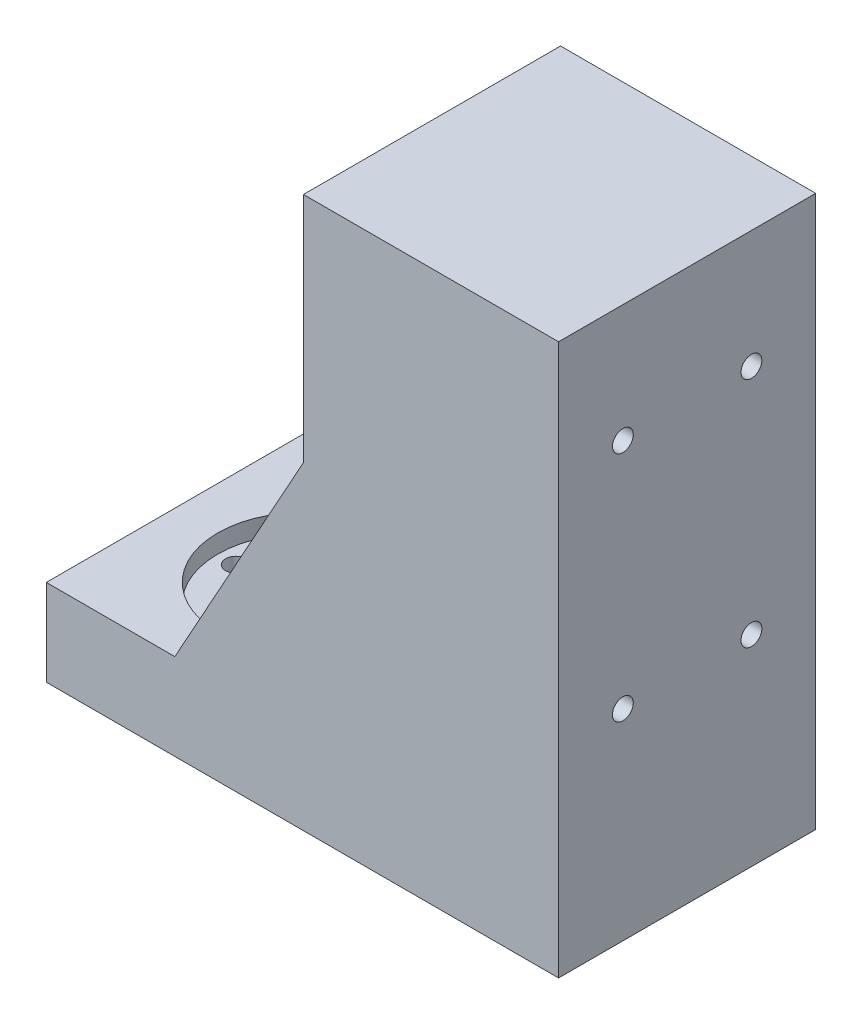
ISO-10303-21;
HEADER;
FILE_DESCRIPTION(('STEP AP214'),'2;1');
FILE_NAME('part.step','',(''),(''),'','','');
FILE_SCHEMA(('AUTOMOTIVE_DESIGN { 1 0 10303 214 1 1 1 1 }'));
ENDSEC;
DATA;
#1=APPLICATION_CONTEXT('core data for automotive mechanical design processes');
#2=APPLICATION_PROTOCOL_DEFINITION('international standard','automotive_design',2000,#1);
#3=PRODUCT_CONTEXT('',#1,'mechanical');
#4=PRODUCT('Part','Part','',(#3));
#5=PRODUCT_RELATED_PRODUCT_CATEGORY('part','',(#4));
#6=PRODUCT_DEFINITION_FORMATION('','',#4);
#7=PRODUCT_DEFINITION_CONTEXT('part definition',#1,'design');
#8=PRODUCT_DEFINITION('design','',#6,#7);
#9=PRODUCT_DEFINITION_SHAPE('','',#8);
#10=(LENGTH_UNIT() NAMED_UNIT(*) SI_UNIT(.MILLI.,.METRE.));
#11=(NAMED_UNIT(*) PLANE_ANGLE_UNIT() SI_UNIT($,.RADIAN.));
#12=(NAMED_UNIT(*) SI_UNIT($,.STERADIAN.) SOLID_ANGLE_UNIT());
#13=UNCERTAINTY_MEASURE_WITH_UNIT(LENGTH_MEASURE(1.E-05),#10,'distance_accuracy_value','');
#14=(GEOMETRIC_REPRESENTATION_CONTEXT(3) GLOBAL_UNCERTAINTY_ASSIGNED_CONTEXT((#13)) GLOBAL_UNIT_ASSIGNED_CONTEXT((#10,
#11,#12)) REPRESENTATION_CONTEXT('',''));
#15=CARTESIAN_POINT('',(0.,0.,0.));
#16=DIRECTION('',(0.,0.,1.));
#17=DIRECTION('',(1.,0.,0.));
#18=AXIS2_PLACEMENT_3D('',#15,#16,#17);
#19=CARTESIAN_POINT('',(21.,-14.1207956609657,21.));
#20=DIRECTION('',(0.,1.,0.));
#21=DIRECTION('',(0.,0.,1.));
#22=AXIS2_PLACEMENT_3D('',#19,#20,#21);
#23=CYLINDRICAL_SURFACE('',#22,2.99999999999999);
#24=CARTESIAN_POINT('',(21.,-14.1207956609657,21.));
#25=DIRECTION('',(0.,1.,0.));
#26=DIRECTION('',(0.,0.,1.));
#27=AXIS2_PLACEMENT_3D('',#24,#25,#26);
#28=CIRCLE('',#27,2.99999999999999);
#29=CARTESIAN_POINT('',(21.,-14.1207956609657,24.));
#30=VERTEX_POINT('',#29);
#31=EDGE_CURVE('E221',#30,#30,#28,.T.);
#32=CARTESIAN_POINT('',(21.,-5.,21.));
#33=DIRECTION('',(0.,1.,0.));
#34=DIRECTION('',(0.,0.,1.));
#35=AXIS2_PLACEMENT_3D('',#32,#33,#34);
#36=CIRCLE('',#35,2.99999999999999);
#37=CARTESIAN_POINT('',(21.,-5.,24.));
#38=VERTEX_POINT('',#37);
#39=EDGE_CURVE('E47',#38,#38,#36,.F.);
#40=CARTESIAN_POINT('',(21.,-14.1207956609657,24.));
#41=CARTESIAN_POINT('',(21.,-14.0257873728307,24.));
#42=CARTESIAN_POINT('',(21.,-13.9307790846956,24.));
#43=CARTESIAN_POINT('',(21.,-13.7407625084255,24.));
#44=CARTESIAN_POINT('',(21.,-13.6457542202904,24.));
#45=CARTESIAN_POINT('',(21.,-13.4557376440203,24.));
#46=CARTESIAN_POINT('',(21.,-13.3607293558853,24.));
#47=CARTESIAN_POINT('',(21.,-13.1707127796151,24.));
#48=CARTESIAN_POINT('',(21.,-13.0757044914801,24.));
#49=CARTESIAN_POINT('',(21.,-12.88568791521,24.));
#50=CARTESIAN_POINT('',(21.,-12.7906796270749,24.));
#51=CARTESIAN_POINT('',(21.,-12.6006630508048,24.));
#52=CARTESIAN_POINT('',(21.,-12.5056547626697,24.));
#53=CARTESIAN_POINT('',(21.,-12.3156381863996,24.));
#54=CARTESIAN_POINT('',(21.,-12.2206298982645,24.));
#55=CARTESIAN_POINT('',(21.,-12.0306133219944,24.));
#56=CARTESIAN_POINT('',(21.,-11.9356050338594,24.));
#57=CARTESIAN_POINT('',(21.,-11.7455884575892,24.));
#58=CARTESIAN_POINT('',(21.,-11.6505801694542,24.));
#59=CARTESIAN_POINT('',(21.,-11.4605635931841,24.));
#60=CARTESIAN_POINT('',(21.,-11.365555305049,24.));
#61=CARTESIAN_POINT('',(21.,-11.1755387287789,24.));
#62=CARTESIAN_POINT('',(21.,-11.0805304406438,24.));
#63=CARTESIAN_POINT('',(21.,-10.8905138643737,24.));
#64=CARTESIAN_POINT('',(21.,-10.7955055762386,24.));
#65=CARTESIAN_POINT('',(21.,-10.6054889999685,24.));
#66=CARTESIAN_POINT('',(21.,-10.5104807118335,24.));
#67=CARTESIAN_POINT('',(21.,-10.3204641355633,24.));
#68=CARTESIAN_POINT('',(21.,-10.2254558474283,24.));
#69=CARTESIAN_POINT('',(21.,-10.0354392711582,24.));
#70=CARTESIAN_POINT('',(21.,-9.94043098302311,24.));
#71=CARTESIAN_POINT('',(21.,-9.75041440675299,24.));
#72=CARTESIAN_POINT('',(21.,-9.65540611861793,24.));
#73=CARTESIAN_POINT('',(21.,-9.46538954234781,24.));
#74=CARTESIAN_POINT('',(21.,-9.37038125421275,24.));
#75=CARTESIAN_POINT('',(21.,-9.18036467794263,24.));
#76=CARTESIAN_POINT('',(21.,-9.08535638980757,24.));
#77=CARTESIAN_POINT('',(21.,-8.89533981353745,24.));
#78=CARTESIAN_POINT('',(21.,-8.80033152540239,24.));
#79=CARTESIAN_POINT('',(21.,-8.61031494913227,24.));
#80=CARTESIAN_POINT('',(21.,-8.51530666099721,24.));
#81=CARTESIAN_POINT('',(21.,-8.32529008472709,24.));
#82=CARTESIAN_POINT('',(21.,-8.23028179659203,24.));
#83=CARTESIAN_POINT('',(21.,-8.04026522032191,24.));
#84=CARTESIAN_POINT('',(21.,-7.94525693218685,24.));
#85=CARTESIAN_POINT('',(21.,-7.75524035591673,24.));
#86=CARTESIAN_POINT('',(21.,-7.66023206778167,24.));
#87=CARTESIAN_POINT('',(21.,-7.47021549151155,24.));
#88=CARTESIAN_POINT('',(21.,-7.37520720337649,24.));
#89=CARTESIAN_POINT('',(21.,-7.18519062710637,24.));
#90=CARTESIAN_POINT('',(21.,-7.09018233897131,24.));
#91=CARTESIAN_POINT('',(21.,-6.90016576270119,24.));
#92=CARTESIAN_POINT('',(21.,-6.80515747456614,24.));
#93=CARTESIAN_POINT('',(21.,-6.61514089829602,24.));
#94=CARTESIAN_POINT('',(21.,-6.52013261016096,24.));
#95=CARTESIAN_POINT('',(21.,-6.33011603389084,24.));
#96=CARTESIAN_POINT('',(21.,-6.23510774575578,24.));
#97=CARTESIAN_POINT('',(21.,-6.04509116948566,24.));
#98=CARTESIAN_POINT('',(21.,-5.9500828813506,24.));
#99=CARTESIAN_POINT('',(21.,-5.76006630508048,24.));
#100=CARTESIAN_POINT('',(21.,-5.66505801694542,24.));
#101=CARTESIAN_POINT('',(21.,-5.4750414406753,24.));
#102=CARTESIAN_POINT('',(21.,-5.38003315254024,24.));
#103=CARTESIAN_POINT('',(21.,-5.19001657627012,24.));
#104=CARTESIAN_POINT('',(21.,-5.09500828813506,24.));
#105=CARTESIAN_POINT('',(21.,-5.,24.));
#106=B_SPLINE_CURVE_WITH_KNOTS('',3,(#40,#41,#42,#43,#44,#45,#46,#47,#48,#49,#50,#51,#52,#53,
#54,#55,#56,#57,#58,#59,#60,#61,#62,#63,#64,#65,#66,#67,#68,#69,#70,#71,#72,#73,#74,#75,#76,#77,
#78,#79,#80,#81,#82,#83,#84,#85,#86,#87,#88,#89,#90,#91,#92,#93,#94,#95,#96,#97,#98,#99,#100,
#101,#102,#103,#104,#105),.UNSPECIFIED.,.F.,.F.,(4,2,2,2,2,2,2,2,2,2,2,2,2,2,2,2,2,2,2,2,2,2,2,
2,2,2,2,2,2,2,2,2,4),(0.,0.285024864405179,0.570049728810359,0.855074593215538,1.14009945762072,
1.4251243220259,1.71014918643107,1.99517405083625,2.28019891524143,2.56522377964661,
2.85024864405179,3.13527350845697,3.42029837286215,3.70532323726733,3.99034810167251,
4.27537296607769,4.56039783048287,4.84542269488805,5.13044755929322,5.4154724236984,
5.70049728810358,5.98552215250876,6.27054701691394,6.55557188131912,6.8405967457243,
7.12562161012948,7.41064647453466,7.69567133893984,7.98069620334502,8.26572106775019,
8.55074593215537,8.83577079656055,9.12079566096573),.UNSPECIFIED.);
#107=EDGE_CURVE('BSEAM44',#30,#38,#106,.T.);
#108=ORIENTED_EDGE('',*,*,#31,.F.);
#109=ORIENTED_EDGE('',*,*,#39,.F.);
#110=ORIENTED_EDGE('',*,*,#107,.T.);
#111=ORIENTED_EDGE('',*,*,#107,.F.);
#112=EDGE_LOOP('',(#108,#110,#109,#111));
#113=FACE_BOUND('',#112,.T.);
#114=ADVANCED_FACE('F44',(#113),#23,.F.);
#115=CARTESIAN_POINT('',(0.,0.,42.));
#116=DIRECTION('',(1.,0.,0.));
#117=DIRECTION('',(0.,1.,0.));
#118=AXIS2_PLACEMENT_3D('',#115,#116,#117);
#119=PLANE('',#118);
#120=DIRECTION('',(0.,-1.,0.));
#121=VECTOR('',#120,1.);
#122=CARTESIAN_POINT('',(0.,0.,0.));
#123=LINE('',#122,#121);
#124=CARTESIAN_POINT('',(0.,0.,0.));
#125=VERTEX_POINT('',#124);
#126=CARTESIAN_POINT('',(0.,-14.1207956609657,0.));
#127=VERTEX_POINT('',#126);
#128=EDGE_CURVE('E135',#125,#127,#123,.T.);
#129=ORIENTED_EDGE('',*,*,#128,.T.);
#130=DIRECTION('',(0.,0.,-1.));
#131=VECTOR('',#130,1.);
#132=CARTESIAN_POINT('',(0.,-14.1207956609657,42.));
#133=LINE('',#132,#131);
#134=CARTESIAN_POINT('',(0.,-14.1207956609657,42.));
#135=VERTEX_POINT('',#134);
#136=EDGE_CURVE('E11',#135,#127,#133,.T.);
#137=ORIENTED_EDGE('',*,*,#136,.F.);
#138=DIRECTION('',(0.,-1.,0.));
#139=VECTOR('',#138,1.);
#140=CARTESIAN_POINT('',(0.,0.,42.));
#141=LINE('',#140,#139);
#142=CARTESIAN_POINT('',(0.,0.,42.));
#143=VERTEX_POINT('',#142);
#144=EDGE_CURVE('E134',#143,#135,#141,.T.);
#145=ORIENTED_EDGE('',*,*,#144,.F.);
#146=DIRECTION('',(0.,0.,-1.));
#147=VECTOR('',#146,1.);
#148=CARTESIAN_POINT('',(0.,0.,42.));
#149=LINE('',#148,#147);
#150=EDGE_CURVE('E241',#143,#125,#149,.T.);
#151=ORIENTED_EDGE('',*,*,#150,.T.);
#152=EDGE_LOOP('',(#129,#137,#145,#151));
#153=FACE_BOUND('',#152,.T.);
#154=ADVANCED_FACE('F50',(#153),#119,.F.);
#155=CARTESIAN_POINT('',(42.,-14.1207956609657,42.));
#156=DIRECTION('',(0.,1.,0.));
#157=DIRECTION('',(0.,0.,1.));
#158=AXIS2_PLACEMENT_3D('',#155,#156,#157);
#159=PLANE('',#158);
#160=CARTESIAN_POINT('',(21.,-14.1207956609657,10.));
#161=DIRECTION('',(0.,1.,0.));
#162=DIRECTION('',(0.,0.,1.));
#163=AXIS2_PLACEMENT_3D('',#160,#161,#162);
#164=CIRCLE('',#163,1.7);
#165=CARTESIAN_POINT('',(21.,-14.1207956609657,11.7));
#166=VERTEX_POINT('',#165);
#167=EDGE_CURVE('E212',#166,#166,#164,.T.);
#168=ORIENTED_EDGE('',*,*,#167,.T.);
#169=EDGE_LOOP('',(#168));
#170=FACE_BOUND('',#169,.T.);
#171=CARTESIAN_POINT('',(32.,-14.1207956609657,21.));
#172=DIRECTION('',(0.,1.,0.));
#173=DIRECTION('',(0.,0.,1.));
#174=AXIS2_PLACEMENT_3D('',#171,#172,#173);
#175=CIRCLE('',#174,1.7);
#176=CARTESIAN_POINT('',(32.,-14.1207956609657,22.7));
#177=VERTEX_POINT('',#176);
#178=EDGE_CURVE('E211',#177,#177,#175,.T.);
#179=ORIENTED_EDGE('',*,*,#178,.T.);
#180=EDGE_LOOP('',(#179));
#181=FACE_BOUND('',#180,.T.);
#182=CARTESIAN_POINT('',(21.,-14.1207956609657,32.));
#183=DIRECTION('',(0.,1.,0.));
#184=DIRECTION('',(0.,0.,1.));
#185=AXIS2_PLACEMENT_3D('',#182,#183,#184);
#186=CIRCLE('',#185,1.7);
#187=CARTESIAN_POINT('',(21.,-14.1207956609657,33.7));
#188=VERTEX_POINT('',#187);
#189=EDGE_CURVE('E208',#188,#188,#186,.T.);
#190=ORIENTED_EDGE('',*,*,#189,.T.);
#191=EDGE_LOOP('',(#190));
#192=FACE_BOUND('',#191,.T.);
#193=CARTESIAN_POINT('',(10.,-14.1207956609657,21.));
#194=DIRECTION('',(0.,1.,0.));
#195=DIRECTION('',(0.,0.,1.));
#196=AXIS2_PLACEMENT_3D('',#193,#194,#195);
#197=CIRCLE('',#196,1.7);
#198=CARTESIAN_POINT('',(10.,-14.1207956609657,22.7));
#199=VERTEX_POINT('',#198);
#200=EDGE_CURVE('E197',#199,#199,#197,.T.);
#201=ORIENTED_EDGE('',*,*,#200,.T.);
#202=EDGE_LOOP('',(#201));
#203=FACE_BOUND('',#202,.T.);
#204=ORIENTED_EDGE('',*,*,#31,.T.);
#205=EDGE_LOOP('',(#204));
#206=FACE_BOUND('',#205,.T.);
#207=DIRECTION('',(1.,0.,0.));
#208=VECTOR('',#207,1.);
#209=CARTESIAN_POINT('',(42.,-14.1207956609657,0.));
#210=LINE('',#209,#208);
#211=CARTESIAN_POINT('',(83.67900317515,-14.1207956609657,0.));
#212=VERTEX_POINT('',#211);
#213=EDGE_CURVE('E244',#127,#212,#210,.T.);
#214=ORIENTED_EDGE('',*,*,#213,.T.);
#215=DIRECTION('',(0.,0.,-1.));
#216=VECTOR('',#215,1.);
#217=CARTESIAN_POINT('',(83.67900317515,-14.1207956609657,42.));
#218=LINE('',#217,#216);
#219=CARTESIAN_POINT('',(83.67900317515,-14.1207956609657,42.));
#220=VERTEX_POINT('',#219);
#221=EDGE_CURVE('E53',#220,#212,#218,.T.);
#222=ORIENTED_EDGE('',*,*,#221,.F.);
#223=DIRECTION('',(1.,0.,0.));
#224=VECTOR('',#223,1.);
#225=CARTESIAN_POINT('',(0.,-14.1207956609657,42.));
#226=LINE('',#225,#224);
#227=EDGE_CURVE('E235',#135,#220,#226,.T.);
#228=ORIENTED_EDGE('',*,*,#227,.F.);
#229=ORIENTED_EDGE('',*,*,#136,.T.);
#230=EDGE_LOOP('',(#214,#222,#228,#229));
#231=FACE_BOUND('',#230,.T.);
#232=ADVANCED_FACE('F279',(#170,#181,#192,#203,#206,#231),#159,.F.);
#233=CARTESIAN_POINT('',(83.67900317515,-14.1207956609657,42.));
#234=DIRECTION('',(-1.,0.,0.));
#235=DIRECTION('',(0.,0.,1.));
#236=AXIS2_PLACEMENT_3D('',#233,#234,#235);
#237=PLANE('',#236);
#238=CARTESIAN_POINT('',(83.67900317515,56.6542043390343,31.5));
#239=DIRECTION('',(-1.,0.,0.));
#240=DIRECTION('',(0.,0.,1.));
#241=AXIS2_PLACEMENT_3D('',#238,#239,#240);
#242=CIRCLE('',#241,1.7);
#243=CARTESIAN_POINT('',(83.67900317515,56.6542043390343,33.2));
#244=VERTEX_POINT('',#243);
#245=EDGE_CURVE('E177',#244,#244,#242,.T.);
#246=ORIENTED_EDGE('',*,*,#245,.T.);
#247=EDGE_LOOP('',(#246));
#248=FACE_BOUND('',#247,.T.);
#249=CARTESIAN_POINT('',(83.67900317515,18.7146021695171,10.5));
#250=DIRECTION('',(-1.,0.,0.));
#251=DIRECTION('',(0.,0.,1.));
#252=AXIS2_PLACEMENT_3D('',#249,#250,#251);
#253=CIRCLE('',#252,1.7);
#254=CARTESIAN_POINT('',(83.67900317515,18.7146021695171,12.2));
#255=VERTEX_POINT('',#254);
#256=EDGE_CURVE('E171',#255,#255,#253,.T.);
#257=ORIENTED_EDGE('',*,*,#256,.T.);
#258=EDGE_LOOP('',(#257));
#259=FACE_BOUND('',#258,.T.);
#260=CARTESIAN_POINT('',(83.67900317515,18.7146021695171,31.5));
#261=DIRECTION('',(-1.,0.,0.));
#262=DIRECTION('',(0.,0.,1.));
#263=AXIS2_PLACEMENT_3D('',#260,#261,#262);
#264=CIRCLE('',#263,1.7);
#265=CARTESIAN_POINT('',(83.67900317515,18.7146021695171,33.2));
#266=VERTEX_POINT('',#265);
#267=EDGE_CURVE('E170',#266,#266,#264,.T.);
#268=ORIENTED_EDGE('',*,*,#267,.T.);
#269=EDGE_LOOP('',(#268));
#270=FACE_BOUND('',#269,.T.);
#271=CARTESIAN_POINT('',(83.67900317515,56.6542043390343,10.5));
#272=DIRECTION('',(-1.,0.,0.));
#273=DIRECTION('',(0.,0.,1.));
#274=AXIS2_PLACEMENT_3D('',#271,#272,#273);
#275=CIRCLE('',#274,1.7);
#276=CARTESIAN_POINT('',(83.67900317515,56.6542043390343,12.2));
#277=VERTEX_POINT('',#276);
#278=EDGE_CURVE('E186',#277,#277,#275,.T.);
#279=ORIENTED_EDGE('',*,*,#278,.T.);
#280=EDGE_LOOP('',(#279));
#281=FACE_BOUND('',#280,.T.);
#282=DIRECTION('',(0.,1.,0.));
#283=VECTOR('',#282,1.);
#284=CARTESIAN_POINT('',(83.67900317515,-14.1207956609657,0.));
#285=LINE('',#284,#283);
#286=CARTESIAN_POINT('',(83.67900317515,75.8792043390343,0.));
#287=VERTEX_POINT('',#286);
#288=EDGE_CURVE('E250',#212,#287,#285,.T.);
#289=ORIENTED_EDGE('',*,*,#288,.T.);
#290=DIRECTION('',(0.,0.,-1.));
#291=VECTOR('',#290,1.);
#292=CARTESIAN_POINT('',(83.67900317515,75.8792043390343,42.));
#293=LINE('',#292,#291);
#294=CARTESIAN_POINT('',(83.67900317515,75.8792043390343,42.));
#295=VERTEX_POINT('',#294);
#296=EDGE_CURVE('E256',#295,#287,#293,.T.);
#297=ORIENTED_EDGE('',*,*,#296,.F.);
#298=DIRECTION('',(0.,1.,0.));
#299=VECTOR('',#298,1.);
#300=CARTESIAN_POINT('',(83.67900317515,-14.1207956609657,42.));
#301=LINE('',#300,#299);
#302=EDGE_CURVE('E234',#220,#295,#301,.T.);
#303=ORIENTED_EDGE('',*,*,#302,.F.);
#304=ORIENTED_EDGE('',*,*,#221,.T.);
#305=EDGE_LOOP('',(#289,#297,#303,#304));
#306=FACE_BOUND('',#305,.T.);
#307=ADVANCED_FACE('F305',(#248,#259,#270,#281,#306),#237,.F.);
#308=CARTESIAN_POINT('',(83.67900317515,75.8792043390343,42.));
#309=DIRECTION('',(0.,-1.,0.));
#310=DIRECTION('',(0.,0.,-1.));
#311=AXIS2_PLACEMENT_3D('',#308,#309,#310);
#312=PLANE('',#311);
#313=DIRECTION('',(-1.,0.,0.));
#314=VECTOR('',#313,1.);
#315=CARTESIAN_POINT('',(83.67900317515,75.8792043390343,0.));
#316=LINE('',#315,#314);
#317=CARTESIAN_POINT('',(42.,75.8792043390343,0.));
#318=VERTEX_POINT('',#317);
#319=EDGE_CURVE('E249',#287,#318,#316,.T.);
#320=ORIENTED_EDGE('',*,*,#319,.T.);
#321=DIRECTION('',(0.,0.,-1.));
#322=VECTOR('',#321,1.);
#323=CARTESIAN_POINT('',(42.,75.8792043390343,42.));
#324=LINE('',#323,#322);
#325=CARTESIAN_POINT('',(42.,75.8792043390343,42.));
#326=VERTEX_POINT('',#325);
#327=EDGE_CURVE('E254',#326,#318,#324,.T.);
#328=ORIENTED_EDGE('',*,*,#327,.F.);
#329=DIRECTION('',(-1.,0.,0.));
#330=VECTOR('',#329,1.);
#331=CARTESIAN_POINT('',(83.67900317515,75.8792043390343,42.));
#332=LINE('',#331,#330);
#333=EDGE_CURVE('E237',#295,#326,#332,.T.);
#334=ORIENTED_EDGE('',*,*,#333,.F.);
#335=ORIENTED_EDGE('',*,*,#296,.T.);
#336=EDGE_LOOP('',(#320,#328,#334,#335));
#337=FACE_BOUND('',#336,.T.);
#338=ADVANCED_FACE('F296',(#337),#312,.F.);
#339=CARTESIAN_POINT('',(42.,75.8792043390343,42.));
#340=DIRECTION('',(1.,0.,0.));
#341=DIRECTION('',(0.,1.,0.));
#342=AXIS2_PLACEMENT_3D('',#339,#340,#341);
#343=PLANE('',#342);
#344=CARTESIAN_POINT('',(42.,56.6542043390343,31.5));
#345=DIRECTION('',(-1.,0.,0.));
#346=DIRECTION('',(0.,0.,1.));
#347=AXIS2_PLACEMENT_3D('',#344,#345,#346);
#348=CIRCLE('',#347,1.7);
#349=CARTESIAN_POINT('',(42.,56.6542043390343,33.2));
#350=VERTEX_POINT('',#349);
#351=EDGE_CURVE('E178',#350,#350,#348,.T.);
#352=ORIENTED_EDGE('',*,*,#351,.F.);
#353=EDGE_LOOP('',(#352));
#354=FACE_BOUND('',#353,.T.);
#355=CARTESIAN_POINT('',(42.,18.7146021695171,10.5));
#356=DIRECTION('',(-1.,0.,0.));
#357=DIRECTION('',(0.,0.,1.));
#358=AXIS2_PLACEMENT_3D('',#355,#356,#357);
#359=CIRCLE('',#358,1.7);
#360=CARTESIAN_POINT('',(42.,18.7146021695171,12.2));
#361=VERTEX_POINT('',#360);
#362=EDGE_CURVE('E181',#361,#361,#359,.T.);
#363=ORIENTED_EDGE('',*,*,#362,.F.);
#364=EDGE_LOOP('',(#363));
#365=FACE_BOUND('',#364,.T.);
#366=CARTESIAN_POINT('',(42.,18.7146021695171,31.5));
#367=DIRECTION('',(-1.,0.,0.));
#368=DIRECTION('',(0.,0.,1.));
#369=AXIS2_PLACEMENT_3D('',#366,#367,#368);
#370=CIRCLE('',#369,1.7);
#371=CARTESIAN_POINT('',(42.,18.7146021695171,33.2));
#372=VERTEX_POINT('',#371);
#373=EDGE_CURVE('E168',#372,#372,#370,.T.);
#374=ORIENTED_EDGE('',*,*,#373,.F.);
#375=EDGE_LOOP('',(#374));
#376=FACE_BOUND('',#375,.T.);
#377=CARTESIAN_POINT('',(42.,56.6542043390343,10.5));
#378=DIRECTION('',(-1.,0.,0.));
#379=DIRECTION('',(0.,0.,1.));
#380=AXIS2_PLACEMENT_3D('',#377,#378,#379);
#381=CIRCLE('',#380,1.7);
#382=CARTESIAN_POINT('',(42.,56.6542043390343,12.2));
#383=VERTEX_POINT('',#382);
#384=EDGE_CURVE('E179',#383,#383,#381,.T.);
#385=ORIENTED_EDGE('',*,*,#384,.F.);
#386=EDGE_LOOP('',(#385));
#387=FACE_BOUND('',#386,.T.);
#388=DIRECTION('',(0.,-1.,0.));
#389=VECTOR('',#388,1.);
#390=CARTESIAN_POINT('',(42.,75.8792043390343,0.));
#391=LINE('',#390,#389);
#392=CARTESIAN_POINT('',(42.,37.9396021695171,0.));
#393=VERTEX_POINT('',#392);
#394=EDGE_CURVE('E138',#318,#393,#391,.T.);
#395=ORIENTED_EDGE('',*,*,#394,.T.);
#396=DIRECTION('',(0.,0.,-1.));
#397=VECTOR('',#396,1.);
#398=CARTESIAN_POINT('',(42.,37.9396021695171,2.));
#399=LINE('',#398,#397);
#400=CARTESIAN_POINT('',(42.,37.9396021695171,2.));
#401=VERTEX_POINT('',#400);
#402=EDGE_CURVE('E65',#401,#393,#399,.T.);
#403=ORIENTED_EDGE('',*,*,#402,.F.);
#404=DIRECTION('',(0.,-1.,0.));
#405=VECTOR('',#404,1.);
#406=CARTESIAN_POINT('',(42.,0.,2.));
#407=LINE('',#406,#405);
#408=CARTESIAN_POINT('',(42.,0.,2.00000000000002));
#409=VERTEX_POINT('',#408);
#410=EDGE_CURVE('E148',#401,#409,#407,.T.);
#411=ORIENTED_EDGE('',*,*,#410,.T.);
#412=DIRECTION('',(0.,0.,-1.));
#413=VECTOR('',#412,1.);
#414=CARTESIAN_POINT('',(42.,0.,42.));
#415=LINE('',#414,#413);
#416=CARTESIAN_POINT('',(42.,0.,40.));
#417=VERTEX_POINT('',#416);
#418=EDGE_CURVE('E251',#417,#409,#415,.T.);
#419=ORIENTED_EDGE('',*,*,#418,.F.);
#420=DIRECTION('',(0.,1.,0.));
#421=VECTOR('',#420,1.);
#422=CARTESIAN_POINT('',(42.,0.,40.));
#423=LINE('',#422,#421);
#424=CARTESIAN_POINT('',(42.,37.9396021695171,40.));
#425=VERTEX_POINT('',#424);
#426=EDGE_CURVE('E152',#417,#425,#423,.T.);
#427=ORIENTED_EDGE('',*,*,#426,.T.);
#428=DIRECTION('',(0.,0.,1.));
#429=VECTOR('',#428,1.);
#430=CARTESIAN_POINT('',(42.,37.9396021695171,40.));
#431=LINE('',#430,#429);
#432=CARTESIAN_POINT('',(42.,37.9396021695171,42.));
#433=VERTEX_POINT('',#432);
#434=EDGE_CURVE('E165',#425,#433,#431,.T.);
#435=ORIENTED_EDGE('',*,*,#434,.T.);
#436=DIRECTION('',(0.,-1.,0.));
#437=VECTOR('',#436,1.);
#438=CARTESIAN_POINT('',(42.,75.8792043390343,42.));
#439=LINE('',#438,#437);
#440=EDGE_CURVE('E236',#326,#433,#439,.T.);
#441=ORIENTED_EDGE('',*,*,#440,.F.);
#442=ORIENTED_EDGE('',*,*,#327,.T.);
#443=EDGE_LOOP('',(#395,#403,#411,#419,#427,#435,#441,#442));
#444=FACE_BOUND('',#443,.T.);
#445=ADVANCED_FACE('F294',(#354,#365,#376,#387,#444),#343,.F.);
#446=CARTESIAN_POINT('',(0.,0.,42.));
#447=DIRECTION('',(0.,-1.,0.));
#448=DIRECTION('',(0.,0.,-1.));
#449=AXIS2_PLACEMENT_3D('',#446,#447,#448);
#450=PLANE('',#449);
#451=CARTESIAN_POINT('',(21.,0.,21.));
#452=DIRECTION('',(0.,1.,0.));
#453=DIRECTION('',(0.,0.,1.));
#454=AXIS2_PLACEMENT_3D('',#451,#452,#453);
#455=CIRCLE('',#454,14.);
#456=CARTESIAN_POINT('',(21.,0.,35.));
#457=VERTEX_POINT('',#456);
#458=EDGE_CURVE('E223',#457,#457,#455,.T.);
#459=ORIENTED_EDGE('',*,*,#458,.F.);
#460=EDGE_LOOP('',(#459));
#461=FACE_BOUND('',#460,.T.);
#462=DIRECTION('',(-1.,0.,0.));
#463=VECTOR('',#462,1.);
#464=CARTESIAN_POINT('',(21.,0.,2.));
#465=LINE('',#464,#463);
#466=CARTESIAN_POINT('',(21.,0.,2.));
#467=VERTEX_POINT('',#466);
#468=EDGE_CURVE('E67',#409,#467,#465,.T.);
#469=ORIENTED_EDGE('',*,*,#468,.T.);
#470=DIRECTION('',(0.,0.,-1.));
#471=VECTOR('',#470,1.);
#472=CARTESIAN_POINT('',(21.,0.,2.));
#473=LINE('',#472,#471);
#474=CARTESIAN_POINT('',(21.,0.,0.));
#475=VERTEX_POINT('',#474);
#476=EDGE_CURVE('E136',#467,#475,#473,.T.);
#477=ORIENTED_EDGE('',*,*,#476,.T.);
#478=DIRECTION('',(-1.,0.,0.));
#479=VECTOR('',#478,1.);
#480=CARTESIAN_POINT('',(0.,0.,0.));
#481=LINE('',#480,#479);
#482=EDGE_CURVE('E127',#475,#125,#481,.T.);
#483=ORIENTED_EDGE('',*,*,#482,.T.);
#484=ORIENTED_EDGE('',*,*,#150,.F.);
#485=DIRECTION('',(-1.,0.,0.));
#486=VECTOR('',#485,1.);
#487=CARTESIAN_POINT('',(0.,0.,42.));
#488=LINE('',#487,#486);
#489=CARTESIAN_POINT('',(21.,0.,42.));
#490=VERTEX_POINT('',#489);
#491=EDGE_CURVE('E243',#490,#143,#488,.T.);
#492=ORIENTED_EDGE('',*,*,#491,.F.);
#493=DIRECTION('',(0.,0.,1.));
#494=VECTOR('',#493,1.);
#495=CARTESIAN_POINT('',(21.,0.,40.));
#496=LINE('',#495,#494);
#497=CARTESIAN_POINT('',(21.,0.,40.));
#498=VERTEX_POINT('',#497);
#499=EDGE_CURVE('E163',#498,#490,#496,.T.);
#500=ORIENTED_EDGE('',*,*,#499,.F.);
#501=DIRECTION('',(1.,0.,0.));
#502=VECTOR('',#501,1.);
#503=CARTESIAN_POINT('',(21.,0.,40.));
#504=LINE('',#503,#502);
#505=EDGE_CURVE('E157',#498,#417,#504,.T.);
#506=ORIENTED_EDGE('',*,*,#505,.T.);
#507=ORIENTED_EDGE('',*,*,#418,.T.);
#508=EDGE_LOOP('',(#469,#477,#483,#484,#492,#500,#506,#507));
#509=FACE_BOUND('',#508,.T.);
#510=ADVANCED_FACE('F139',(#461,#509),#450,.F.);
#511=CARTESIAN_POINT('',(0.,0.,42.));
#512=DIRECTION('',(0.,0.,1.));
#513=DIRECTION('',(1.,0.,0.));
#514=AXIS2_PLACEMENT_3D('',#511,#512,#513);
#515=PLANE('',#514);
#516=ORIENTED_EDGE('',*,*,#440,.T.);
#517=DIRECTION('',(-0.484275640934718,-0.874915483688149,0.));
#518=VECTOR('',#517,1.);
#519=CARTESIAN_POINT('',(42.,37.9396021695171,42.));
#520=LINE('',#519,#518);
#521=EDGE_CURVE('E155',#433,#490,#520,.T.);
#522=ORIENTED_EDGE('',*,*,#521,.T.);
#523=ORIENTED_EDGE('',*,*,#491,.T.);
#524=ORIENTED_EDGE('',*,*,#144,.T.);
#525=ORIENTED_EDGE('',*,*,#227,.T.);
#526=ORIENTED_EDGE('',*,*,#302,.T.);
#527=ORIENTED_EDGE('',*,*,#333,.T.);
#528=EDGE_LOOP('',(#516,#522,#523,#524,#525,#526,#527));
#529=FACE_BOUND('',#528,.T.);
#530=ADVANCED_FACE('F284',(#529),#515,.T.);
#531=CARTESIAN_POINT('',(0.,0.,0.));
#532=DIRECTION('',(0.,0.,1.));
#533=DIRECTION('',(1.,0.,0.));
#534=AXIS2_PLACEMENT_3D('',#531,#532,#533);
#535=PLANE('',#534);
#536=ORIENTED_EDGE('',*,*,#128,.F.);
#537=ORIENTED_EDGE('',*,*,#482,.F.);
#538=DIRECTION('',(0.484275640934718,0.874915483688149,0.));
#539=VECTOR('',#538,1.);
#540=CARTESIAN_POINT('',(42.,37.9396021695171,0.));
#541=LINE('',#540,#539);
#542=EDGE_CURVE('E128',#475,#393,#541,.T.);
#543=ORIENTED_EDGE('',*,*,#542,.T.);
#544=ORIENTED_EDGE('',*,*,#394,.F.);
#545=ORIENTED_EDGE('',*,*,#319,.F.);
#546=ORIENTED_EDGE('',*,*,#288,.F.);
#547=ORIENTED_EDGE('',*,*,#213,.F.);
#548=EDGE_LOOP('',(#536,#537,#543,#544,#545,#546,#547));
#549=FACE_BOUND('',#548,.T.);
#550=ADVANCED_FACE('F130',(#549),#535,.F.);
#551=CARTESIAN_POINT('',(21.,-3.,21.));
#552=DIRECTION('',(0.,1.,0.));
#553=DIRECTION('',(0.,0.,1.));
#554=AXIS2_PLACEMENT_3D('',#551,#552,#553);
#555=PLANE('',#554);
#556=CARTESIAN_POINT('',(21.,-3.,10.));
#557=DIRECTION('',(0.,1.,0.));
#558=DIRECTION('',(0.,0.,1.));
#559=AXIS2_PLACEMENT_3D('',#556,#557,#558);
#560=CIRCLE('',#559,1.7);
#561=CARTESIAN_POINT('',(21.,-3.,11.7));
#562=VERTEX_POINT('',#561);
#563=EDGE_CURVE('E194',#562,#562,#560,.T.);
#564=ORIENTED_EDGE('',*,*,#563,.F.);
#565=EDGE_LOOP('',(#564));
#566=FACE_BOUND('',#565,.T.);
#567=CARTESIAN_POINT('',(32.,-3.,21.));
#568=DIRECTION('',(0.,1.,0.));
#569=DIRECTION('',(0.,0.,1.));
#570=AXIS2_PLACEMENT_3D('',#567,#568,#569);
#571=CIRCLE('',#570,1.7);
#572=CARTESIAN_POINT('',(32.,-3.,22.7));
#573=VERTEX_POINT('',#572);
#574=EDGE_CURVE('E196',#573,#573,#571,.T.);
#575=ORIENTED_EDGE('',*,*,#574,.F.);
#576=EDGE_LOOP('',(#575));
#577=FACE_BOUND('',#576,.T.);
#578=CARTESIAN_POINT('',(21.,-3.,32.));
#579=DIRECTION('',(0.,1.,0.));
#580=DIRECTION('',(0.,0.,1.));
#581=AXIS2_PLACEMENT_3D('',#578,#579,#580);
#582=CIRCLE('',#581,1.7);
#583=CARTESIAN_POINT('',(21.,-3.,33.7));
#584=VERTEX_POINT('',#583);
#585=EDGE_CURVE('E203',#584,#584,#582,.T.);
#586=ORIENTED_EDGE('',*,*,#585,.F.);
#587=EDGE_LOOP('',(#586));
#588=FACE_BOUND('',#587,.T.);
#589=CARTESIAN_POINT('',(10.,-3.,21.));
#590=DIRECTION('',(0.,1.,0.));
#591=DIRECTION('',(0.,0.,1.));
#592=AXIS2_PLACEMENT_3D('',#589,#590,#591);
#593=CIRCLE('',#592,1.7);
#594=CARTESIAN_POINT('',(10.,-3.,22.7));
#595=VERTEX_POINT('',#594);
#596=EDGE_CURVE('E193',#595,#595,#593,.T.);
#597=ORIENTED_EDGE('',*,*,#596,.F.);
#598=EDGE_LOOP('',(#597));
#599=FACE_BOUND('',#598,.T.);
#600=CARTESIAN_POINT('',(21.,-3.,21.));
#601=DIRECTION('',(0.,1.,0.));
#602=DIRECTION('',(0.,0.,1.));
#603=AXIS2_PLACEMENT_3D('',#600,#601,#602);
#604=CIRCLE('',#603,9.);
#605=CARTESIAN_POINT('',(21.,-3.,30.));
#606=VERTEX_POINT('',#605);
#607=EDGE_CURVE('E219',#606,#606,#604,.T.);
#608=ORIENTED_EDGE('',*,*,#607,.F.);
#609=EDGE_LOOP('',(#608));
#610=FACE_BOUND('',#609,.T.);
#611=CARTESIAN_POINT('',(21.,-3.,21.));
#612=DIRECTION('',(0.,1.,0.));
#613=DIRECTION('',(0.,0.,1.));
#614=AXIS2_PLACEMENT_3D('',#611,#612,#613);
#615=CIRCLE('',#614,14.);
#616=CARTESIAN_POINT('',(21.,-3.,35.));
#617=VERTEX_POINT('',#616);
#618=EDGE_CURVE('E222',#617,#617,#615,.T.);
#619=ORIENTED_EDGE('',*,*,#618,.T.);
#620=EDGE_LOOP('',(#619));
#621=FACE_BOUND('',#620,.T.);
#622=ADVANCED_FACE('F292',(#566,#577,#588,#599,#610,#621),#555,.T.);
#623=CARTESIAN_POINT('',(21.,-3.,21.));
#624=DIRECTION('',(0.,1.,0.));
#625=DIRECTION('',(0.,0.,1.));
#626=AXIS2_PLACEMENT_3D('',#623,#624,#625);
#627=CYLINDRICAL_SURFACE('',#626,14.);
#628=ORIENTED_EDGE('',*,*,#618,.F.);
#629=EDGE_LOOP('',(#628));
#630=FACE_BOUND('',#629,.T.);
#631=ORIENTED_EDGE('',*,*,#458,.T.);
#632=EDGE_LOOP('',(#631));
#633=FACE_BOUND('',#632,.T.);
#634=ADVANCED_FACE('F281',(#630,#633),#627,.F.);
#635=CARTESIAN_POINT('',(21.,-5.,21.));
#636=DIRECTION('',(0.,1.,0.));
#637=DIRECTION('',(0.,0.,1.));
#638=AXIS2_PLACEMENT_3D('',#635,#636,#637);
#639=PLANE('',#638);
#640=CARTESIAN_POINT('',(21.,-5.,21.));
#641=DIRECTION('',(0.,1.,0.));
#642=DIRECTION('',(0.,0.,1.));
#643=AXIS2_PLACEMENT_3D('',#640,#641,#642);
#644=CIRCLE('',#643,9.);
#645=CARTESIAN_POINT('',(21.,-5.,30.));
#646=VERTEX_POINT('',#645);
#647=EDGE_CURVE('E220',#646,#646,#644,.T.);
#648=ORIENTED_EDGE('',*,*,#647,.T.);
#649=EDGE_LOOP('',(#648));
#650=FACE_BOUND('',#649,.T.);
#651=ORIENTED_EDGE('',*,*,#39,.T.);
#652=EDGE_LOOP('',(#651));
#653=FACE_BOUND('',#652,.T.);
#654=ADVANCED_FACE('F268',(#650,#653),#639,.T.);
#655=CARTESIAN_POINT('',(21.,-5.,21.));
#656=DIRECTION('',(0.,1.,0.));
#657=DIRECTION('',(0.,0.,1.));
#658=AXIS2_PLACEMENT_3D('',#655,#656,#657);
#659=CYLINDRICAL_SURFACE('',#658,9.);
#660=ORIENTED_EDGE('',*,*,#607,.T.);
#661=EDGE_LOOP('',(#660));
#662=FACE_BOUND('',#661,.T.);
#663=ORIENTED_EDGE('',*,*,#647,.F.);
#664=EDGE_LOOP('',(#663));
#665=FACE_BOUND('',#664,.T.);
#666=ADVANCED_FACE('F384',(#662,#665),#659,.F.);
#667=CARTESIAN_POINT('',(10.,-14.41,21.));
#668=DIRECTION('',(0.,1.,0.));
#669=DIRECTION('',(0.,0.,1.));
#670=AXIS2_PLACEMENT_3D('',#667,#668,#669);
#671=CYLINDRICAL_SURFACE('',#670,1.7);
#672=ORIENTED_EDGE('',*,*,#596,.T.);
#673=EDGE_LOOP('',(#672));
#674=FACE_BOUND('',#673,.T.);
#675=ORIENTED_EDGE('',*,*,#200,.F.);
#676=EDGE_LOOP('',(#675));
#677=FACE_BOUND('',#676,.T.);
#678=ADVANCED_FACE('F381',(#674,#677),#671,.F.);
#679=CARTESIAN_POINT('',(21.,-14.41,32.));
#680=DIRECTION('',(0.,1.,0.));
#681=DIRECTION('',(0.,0.,1.));
#682=AXIS2_PLACEMENT_3D('',#679,#680,#681);
#683=CYLINDRICAL_SURFACE('',#682,1.7);
#684=ORIENTED_EDGE('',*,*,#585,.T.);
#685=EDGE_LOOP('',(#684));
#686=FACE_BOUND('',#685,.T.);
#687=ORIENTED_EDGE('',*,*,#189,.F.);
#688=EDGE_LOOP('',(#687));
#689=FACE_BOUND('',#688,.T.);
#690=ADVANCED_FACE('F380',(#686,#689),#683,.F.);
#691=CARTESIAN_POINT('',(32.,-14.41,21.));
#692=DIRECTION('',(0.,1.,0.));
#693=DIRECTION('',(0.,0.,1.));
#694=AXIS2_PLACEMENT_3D('',#691,#692,#693);
#695=CYLINDRICAL_SURFACE('',#694,1.7);
#696=ORIENTED_EDGE('',*,*,#574,.T.);
#697=EDGE_LOOP('',(#696));
#698=FACE_BOUND('',#697,.T.);
#699=ORIENTED_EDGE('',*,*,#178,.F.);
#700=EDGE_LOOP('',(#699));
#701=FACE_BOUND('',#700,.T.);
#702=ADVANCED_FACE('F373',(#698,#701),#695,.F.);
#703=CARTESIAN_POINT('',(21.,-14.41,10.));
#704=DIRECTION('',(0.,1.,0.));
#705=DIRECTION('',(0.,0.,1.));
#706=AXIS2_PLACEMENT_3D('',#703,#704,#705);
#707=CYLINDRICAL_SURFACE('',#706,1.7);
#708=ORIENTED_EDGE('',*,*,#563,.T.);
#709=EDGE_LOOP('',(#708));
#710=FACE_BOUND('',#709,.T.);
#711=ORIENTED_EDGE('',*,*,#167,.F.);
#712=EDGE_LOOP('',(#711));
#713=FACE_BOUND('',#712,.T.);
#714=ADVANCED_FACE('F369',(#710,#713),#707,.F.);
#715=CARTESIAN_POINT('',(83.67900317515,56.6542043390343,10.5));
#716=DIRECTION('',(-1.,0.,0.));
#717=DIRECTION('',(0.,0.,1.));
#718=AXIS2_PLACEMENT_3D('',#715,#716,#717);
#719=CYLINDRICAL_SURFACE('',#718,1.7);
#720=ORIENTED_EDGE('',*,*,#278,.F.);
#721=EDGE_LOOP('',(#720));
#722=FACE_BOUND('',#721,.T.);
#723=ORIENTED_EDGE('',*,*,#384,.T.);
#724=EDGE_LOOP('',(#723));
#725=FACE_BOUND('',#724,.T.);
#726=ADVANCED_FACE('F359',(#722,#725),#719,.F.);
#727=CARTESIAN_POINT('',(83.67900317515,18.7146021695171,31.5));
#728=DIRECTION('',(-1.,0.,0.));
#729=DIRECTION('',(0.,0.,1.));
#730=AXIS2_PLACEMENT_3D('',#727,#728,#729);
#731=CYLINDRICAL_SURFACE('',#730,1.7);
#732=ORIENTED_EDGE('',*,*,#267,.F.);
#733=EDGE_LOOP('',(#732));
#734=FACE_BOUND('',#733,.T.);
#735=ORIENTED_EDGE('',*,*,#373,.T.);
#736=EDGE_LOOP('',(#735));
#737=FACE_BOUND('',#736,.T.);
#738=ADVANCED_FACE('F354',(#734,#737),#731,.F.);
#739=CARTESIAN_POINT('',(83.67900317515,18.7146021695171,10.5));
#740=DIRECTION('',(-1.,0.,0.));
#741=DIRECTION('',(0.,0.,1.));
#742=AXIS2_PLACEMENT_3D('',#739,#740,#741);
#743=CYLINDRICAL_SURFACE('',#742,1.7);
#744=ORIENTED_EDGE('',*,*,#256,.F.);
#745=EDGE_LOOP('',(#744));
#746=FACE_BOUND('',#745,.T.);
#747=ORIENTED_EDGE('',*,*,#362,.T.);
#748=EDGE_LOOP('',(#747));
#749=FACE_BOUND('',#748,.T.);
#750=ADVANCED_FACE('F356',(#746,#749),#743,.F.);
#751=CARTESIAN_POINT('',(83.67900317515,56.6542043390343,31.5));
#752=DIRECTION('',(-1.,0.,0.));
#753=DIRECTION('',(0.,0.,1.));
#754=AXIS2_PLACEMENT_3D('',#751,#752,#753);
#755=CYLINDRICAL_SURFACE('',#754,1.7);
#756=ORIENTED_EDGE('',*,*,#245,.F.);
#757=EDGE_LOOP('',(#756));
#758=FACE_BOUND('',#757,.T.);
#759=ORIENTED_EDGE('',*,*,#351,.T.);
#760=EDGE_LOOP('',(#759));
#761=FACE_BOUND('',#760,.T.);
#762=ADVANCED_FACE('F352',(#758,#761),#755,.F.);
#763=CARTESIAN_POINT('',(42.,37.9396021695171,40.));
#764=DIRECTION('',(-0.874915483688149,0.484275640934718,0.));
#765=DIRECTION('',(-0.484275640934718,-0.874915483688149,0.));
#766=AXIS2_PLACEMENT_3D('',#763,#764,#765);
#767=PLANE('',#766);
#768=ORIENTED_EDGE('',*,*,#521,.F.);
#769=ORIENTED_EDGE('',*,*,#434,.F.);
#770=DIRECTION('',(-0.484275640934718,-0.874915483688149,0.));
#771=VECTOR('',#770,1.);
#772=CARTESIAN_POINT('',(42.,37.9396021695171,40.));
#773=LINE('',#772,#771);
#774=EDGE_CURVE('E160',#425,#498,#773,.T.);
#775=ORIENTED_EDGE('',*,*,#774,.T.);
#776=ORIENTED_EDGE('',*,*,#499,.T.);
#777=EDGE_LOOP('',(#768,#769,#775,#776));
#778=FACE_BOUND('',#777,.T.);
#779=ADVANCED_FACE('F340',(#778),#767,.T.);
#780=CARTESIAN_POINT('',(0.,0.,40.));
#781=DIRECTION('',(0.,0.,-1.));
#782=DIRECTION('',(-1.,0.,0.));
#783=AXIS2_PLACEMENT_3D('',#780,#781,#782);
#784=PLANE('',#783);
#785=ORIENTED_EDGE('',*,*,#426,.F.);
#786=ORIENTED_EDGE('',*,*,#505,.F.);
#787=ORIENTED_EDGE('',*,*,#774,.F.);
#788=EDGE_LOOP('',(#785,#786,#787));
#789=FACE_BOUND('',#788,.T.);
#790=ADVANCED_FACE('F339',(#789),#784,.T.);
#791=CARTESIAN_POINT('',(42.,37.9396021695171,2.));
#792=DIRECTION('',(-0.874915483688149,0.484275640934718,0.));
#793=DIRECTION('',(-0.484275640934718,-0.874915483688149,0.));
#794=AXIS2_PLACEMENT_3D('',#791,#792,#793);
#795=PLANE('',#794);
#796=ORIENTED_EDGE('',*,*,#542,.F.);
#797=ORIENTED_EDGE('',*,*,#476,.F.);
#798=DIRECTION('',(0.484275640934718,0.874915483688149,0.));
#799=VECTOR('',#798,1.);
#800=CARTESIAN_POINT('',(42.,37.9396021695171,2.));
#801=LINE('',#800,#799);
#802=EDGE_CURVE('E141',#467,#401,#801,.T.);
#803=ORIENTED_EDGE('',*,*,#802,.T.);
#804=ORIENTED_EDGE('',*,*,#402,.T.);
#805=EDGE_LOOP('',(#796,#797,#803,#804));
#806=FACE_BOUND('',#805,.T.);
#807=ADVANCED_FACE('F144',(#806),#795,.T.);
#808=CARTESIAN_POINT('',(0.,0.,2.));
#809=DIRECTION('',(0.,0.,-1.));
#810=DIRECTION('',(-1.,0.,0.));
#811=AXIS2_PLACEMENT_3D('',#808,#809,#810);
#812=PLANE('',#811);
#813=ORIENTED_EDGE('',*,*,#410,.F.);
#814=ORIENTED_EDGE('',*,*,#802,.F.);
#815=ORIENTED_EDGE('',*,*,#468,.F.);
#816=EDGE_LOOP('',(#813,#814,#815));
#817=FACE_BOUND('',#816,.T.);
#818=ADVANCED_FACE('F345',(#817),#812,.F.);
#819=CLOSED_SHELL('',(#114,#154,#232,#307,#338,#445,#510,#530,#550,#622,#634,#654,#666,#678,
#690,#702,#714,#726,#738,#750,#762,#779,#790,#807,#818));
#820=MANIFOLD_SOLID_BREP('B2',#819);
#821=ADVANCED_BREP_SHAPE_REPRESENTATION('',(#18,#820),#14);
#822=SHAPE_DEFINITION_REPRESENTATION(#9,#821);
ENDSEC;
END-ISO-10303-21;
